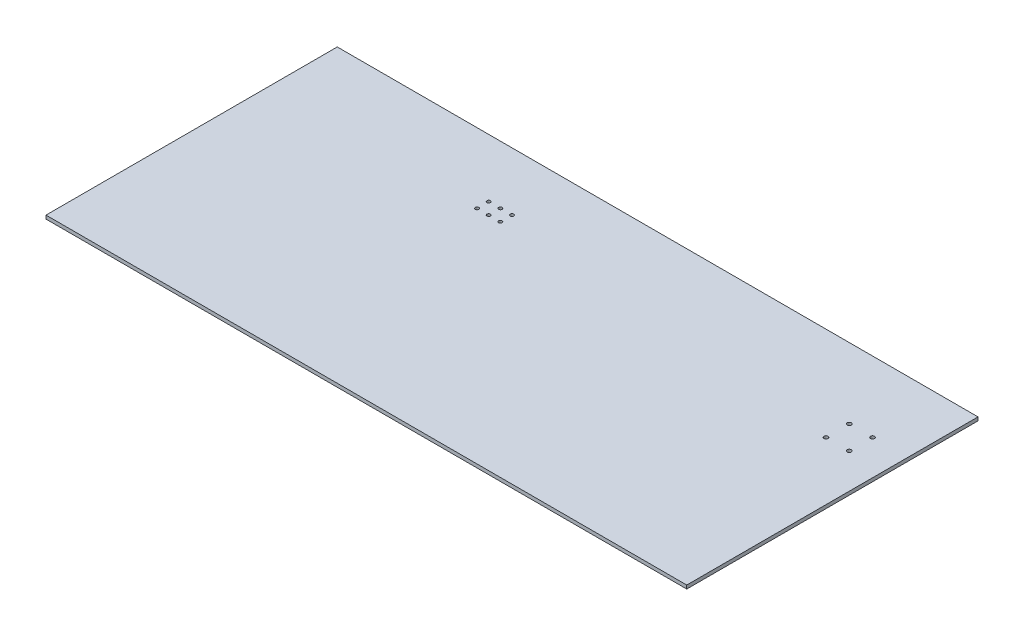
ISO-10303-21;
HEADER;
FILE_DESCRIPTION(('STEP AP214'),'2;1');
FILE_NAME('part.step','',(''),(''),'','','');
FILE_SCHEMA(('AUTOMOTIVE_DESIGN { 1 0 10303 214 1 1 1 1 }'));
ENDSEC;
DATA;
#1=APPLICATION_CONTEXT('core data for automotive mechanical design processes');
#2=APPLICATION_PROTOCOL_DEFINITION('international standard','automotive_design',2000,#1);
#3=PRODUCT_CONTEXT('',#1,'mechanical');
#4=PRODUCT('Part','Part','',(#3));
#5=PRODUCT_RELATED_PRODUCT_CATEGORY('part','',(#4));
#6=PRODUCT_DEFINITION_FORMATION('','',#4);
#7=PRODUCT_DEFINITION_CONTEXT('part definition',#1,'design');
#8=PRODUCT_DEFINITION('design','',#6,#7);
#9=PRODUCT_DEFINITION_SHAPE('','',#8);
#10=(LENGTH_UNIT() NAMED_UNIT(*) SI_UNIT(.MILLI.,.METRE.));
#11=(NAMED_UNIT(*) PLANE_ANGLE_UNIT() SI_UNIT($,.RADIAN.));
#12=(NAMED_UNIT(*) SI_UNIT($,.STERADIAN.) SOLID_ANGLE_UNIT());
#13=UNCERTAINTY_MEASURE_WITH_UNIT(LENGTH_MEASURE(1.E-05),#10,'distance_accuracy_value','');
#14=(GEOMETRIC_REPRESENTATION_CONTEXT(3) GLOBAL_UNCERTAINTY_ASSIGNED_CONTEXT((#13)) GLOBAL_UNIT_ASSIGNED_CONTEXT((#10,
#11,#12)) REPRESENTATION_CONTEXT('',''));
#15=CARTESIAN_POINT('',(0.,0.,0.));
#16=DIRECTION('',(0.,0.,1.));
#17=DIRECTION('',(1.,0.,0.));
#18=AXIS2_PLACEMENT_3D('',#15,#16,#17);
#19=CARTESIAN_POINT('',(-275.,3.,125.));
#20=DIRECTION('',(1.,0.,0.));
#21=DIRECTION('',(0.,0.,-1.));
#22=AXIS2_PLACEMENT_3D('',#19,#20,#21);
#23=PLANE('',#22);
#24=DIRECTION('',(0.,0.,1.));
#25=VECTOR('',#24,1.);
#26=CARTESIAN_POINT('',(-275.,0.,125.));
#27=LINE('',#26,#25);
#28=CARTESIAN_POINT('',(-275.,0.,-125.));
#29=VERTEX_POINT('',#28);
#30=CARTESIAN_POINT('',(-275.,0.,125.));
#31=VERTEX_POINT('',#30);
#32=EDGE_CURVE('E105',#29,#31,#27,.T.);
#33=ORIENTED_EDGE('',*,*,#32,.T.);
#34=DIRECTION('',(0.,-1.,0.));
#35=VECTOR('',#34,1.);
#36=CARTESIAN_POINT('',(-275.,3.,125.));
#37=LINE('',#36,#35);
#38=CARTESIAN_POINT('',(-275.,3.,125.));
#39=VERTEX_POINT('',#38);
#40=EDGE_CURVE('E11',#39,#31,#37,.T.);
#41=ORIENTED_EDGE('',*,*,#40,.F.);
#42=DIRECTION('',(0.,0.,1.));
#43=VECTOR('',#42,1.);
#44=CARTESIAN_POINT('',(-275.,3.,125.));
#45=LINE('',#44,#43);
#46=CARTESIAN_POINT('',(-275.,3.,-125.));
#47=VERTEX_POINT('',#46);
#48=EDGE_CURVE('E92',#47,#39,#45,.T.);
#49=ORIENTED_EDGE('',*,*,#48,.F.);
#50=DIRECTION('',(0.,-1.,0.));
#51=VECTOR('',#50,1.);
#52=CARTESIAN_POINT('',(-275.,3.,-125.));
#53=LINE('',#52,#51);
#54=EDGE_CURVE('E101',#47,#29,#53,.T.);
#55=ORIENTED_EDGE('',*,*,#54,.T.);
#56=EDGE_LOOP('',(#33,#41,#49,#55));
#57=FACE_BOUND('',#56,.T.);
#58=ADVANCED_FACE('F39',(#57),#23,.F.);
#59=CARTESIAN_POINT('',(275.,3.,125.));
#60=DIRECTION('',(0.,0.,-1.));
#61=DIRECTION('',(-1.,0.,0.));
#62=AXIS2_PLACEMENT_3D('',#59,#60,#61);
#63=PLANE('',#62);
#64=DIRECTION('',(1.,0.,0.));
#65=VECTOR('',#64,1.);
#66=CARTESIAN_POINT('',(275.,0.,125.));
#67=LINE('',#66,#65);
#68=CARTESIAN_POINT('',(275.,0.,125.));
#69=VERTEX_POINT('',#68);
#70=EDGE_CURVE('E96',#31,#69,#67,.T.);
#71=ORIENTED_EDGE('',*,*,#70,.T.);
#72=DIRECTION('',(0.,-1.,0.));
#73=VECTOR('',#72,1.);
#74=CARTESIAN_POINT('',(275.,3.,125.));
#75=LINE('',#74,#73);
#76=CARTESIAN_POINT('',(275.,3.,125.));
#77=VERTEX_POINT('',#76);
#78=EDGE_CURVE('E48',#77,#69,#75,.T.);
#79=ORIENTED_EDGE('',*,*,#78,.F.);
#80=DIRECTION('',(1.,0.,0.));
#81=VECTOR('',#80,1.);
#82=CARTESIAN_POINT('',(275.,3.,125.));
#83=LINE('',#82,#81);
#84=EDGE_CURVE('E87',#39,#77,#83,.T.);
#85=ORIENTED_EDGE('',*,*,#84,.F.);
#86=ORIENTED_EDGE('',*,*,#40,.T.);
#87=EDGE_LOOP('',(#71,#79,#85,#86));
#88=FACE_BOUND('',#87,.T.);
#89=ADVANCED_FACE('F95',(#88),#63,.F.);
#90=CARTESIAN_POINT('',(275.,3.,125.));
#91=DIRECTION('',(-1.,0.,0.));
#92=DIRECTION('',(0.,0.,1.));
#93=AXIS2_PLACEMENT_3D('',#90,#91,#92);
#94=PLANE('',#93);
#95=DIRECTION('',(0.,0.,-1.));
#96=VECTOR('',#95,1.);
#97=CARTESIAN_POINT('',(275.,0.,125.));
#98=LINE('',#97,#96);
#99=CARTESIAN_POINT('',(275.,0.,-125.));
#100=VERTEX_POINT('',#99);
#101=EDGE_CURVE('E74',#69,#100,#98,.T.);
#102=ORIENTED_EDGE('',*,*,#101,.T.);
#103=DIRECTION('',(0.,-1.,0.));
#104=VECTOR('',#103,1.);
#105=CARTESIAN_POINT('',(275.,3.,-125.));
#106=LINE('',#105,#104);
#107=CARTESIAN_POINT('',(275.,3.,-125.));
#108=VERTEX_POINT('',#107);
#109=EDGE_CURVE('E97',#108,#100,#106,.T.);
#110=ORIENTED_EDGE('',*,*,#109,.F.);
#111=DIRECTION('',(0.,0.,-1.));
#112=VECTOR('',#111,1.);
#113=CARTESIAN_POINT('',(275.,3.,125.));
#114=LINE('',#113,#112);
#115=EDGE_CURVE('E90',#77,#108,#114,.T.);
#116=ORIENTED_EDGE('',*,*,#115,.F.);
#117=ORIENTED_EDGE('',*,*,#78,.T.);
#118=EDGE_LOOP('',(#102,#110,#116,#117));
#119=FACE_BOUND('',#118,.T.);
#120=ADVANCED_FACE('F99',(#119),#94,.F.);
#121=CARTESIAN_POINT('',(275.,3.,-125.));
#122=DIRECTION('',(0.,0.,1.));
#123=DIRECTION('',(1.,0.,0.));
#124=AXIS2_PLACEMENT_3D('',#121,#122,#123);
#125=PLANE('',#124);
#126=DIRECTION('',(-1.,0.,0.));
#127=VECTOR('',#126,1.);
#128=CARTESIAN_POINT('',(275.,0.,-125.));
#129=LINE('',#128,#127);
#130=EDGE_CURVE('E80',#100,#29,#129,.T.);
#131=ORIENTED_EDGE('',*,*,#130,.T.);
#132=ORIENTED_EDGE('',*,*,#54,.F.);
#133=DIRECTION('',(-1.,0.,0.));
#134=VECTOR('',#133,1.);
#135=CARTESIAN_POINT('',(275.,3.,-125.));
#136=LINE('',#135,#134);
#137=EDGE_CURVE('E57',#108,#47,#136,.T.);
#138=ORIENTED_EDGE('',*,*,#137,.F.);
#139=ORIENTED_EDGE('',*,*,#109,.T.);
#140=EDGE_LOOP('',(#131,#132,#138,#139));
#141=FACE_BOUND('',#140,.T.);
#142=ADVANCED_FACE('F167',(#141),#125,.F.);
#143=CARTESIAN_POINT('',(0.,3.,0.));
#144=DIRECTION('',(0.,1.,0.));
#145=DIRECTION('',(0.,0.,1.));
#146=AXIS2_PLACEMENT_3D('',#143,#144,#145);
#147=PLANE('',#146);
#148=CARTESIAN_POINT('',(-95.,3.,-75.));
#149=DIRECTION('',(0.,1.,0.));
#150=DIRECTION('',(0.,0.,1.));
#151=AXIS2_PLACEMENT_3D('',#148,#149,#150);
#152=CIRCLE('',#151,1.5);
#153=CARTESIAN_POINT('',(-95.,3.,-73.5));
#154=VERTEX_POINT('',#153);
#155=EDGE_CURVE('E350',#154,#154,#152,.T.);
#156=ORIENTED_EDGE('',*,*,#155,.F.);
#157=EDGE_LOOP('',(#156));
#158=FACE_BOUND('',#157,.T.);
#159=CARTESIAN_POINT('',(-75.,3.,-75.));
#160=DIRECTION('',(0.,1.,0.));
#161=DIRECTION('',(0.,0.,1.));
#162=AXIS2_PLACEMENT_3D('',#159,#160,#161);
#163=CIRCLE('',#162,1.5);
#164=CARTESIAN_POINT('',(-75.,3.,-73.5));
#165=VERTEX_POINT('',#164);
#166=EDGE_CURVE('E351',#165,#165,#163,.T.);
#167=ORIENTED_EDGE('',*,*,#166,.F.);
#168=EDGE_LOOP('',(#167));
#169=FACE_BOUND('',#168,.T.);
#170=CARTESIAN_POINT('',(-85.,3.,-75.));
#171=DIRECTION('',(0.,1.,0.));
#172=DIRECTION('',(0.,0.,1.));
#173=AXIS2_PLACEMENT_3D('',#170,#171,#172);
#174=CIRCLE('',#173,1.5);
#175=CARTESIAN_POINT('',(-85.,3.,-73.5));
#176=VERTEX_POINT('',#175);
#177=EDGE_CURVE('E353',#176,#176,#174,.T.);
#178=ORIENTED_EDGE('',*,*,#177,.F.);
#179=EDGE_LOOP('',(#178));
#180=FACE_BOUND('',#179,.T.);
#181=CARTESIAN_POINT('',(-75.,3.,-65.));
#182=DIRECTION('',(0.,1.,0.));
#183=DIRECTION('',(0.,0.,1.));
#184=AXIS2_PLACEMENT_3D('',#181,#182,#183);
#185=CIRCLE('',#184,1.5);
#186=CARTESIAN_POINT('',(-75.,3.,-63.5));
#187=VERTEX_POINT('',#186);
#188=EDGE_CURVE('E358',#187,#187,#185,.T.);
#189=ORIENTED_EDGE('',*,*,#188,.F.);
#190=EDGE_LOOP('',(#189));
#191=FACE_BOUND('',#190,.T.);
#192=CARTESIAN_POINT('',(-85.,3.,-65.));
#193=DIRECTION('',(0.,1.,0.));
#194=DIRECTION('',(0.,0.,1.));
#195=AXIS2_PLACEMENT_3D('',#192,#193,#194);
#196=CIRCLE('',#195,1.5);
#197=CARTESIAN_POINT('',(-85.,3.,-63.5));
#198=VERTEX_POINT('',#197);
#199=EDGE_CURVE('E361',#198,#198,#196,.T.);
#200=ORIENTED_EDGE('',*,*,#199,.F.);
#201=EDGE_LOOP('',(#200));
#202=FACE_BOUND('',#201,.T.);
#203=CARTESIAN_POINT('',(-95.,3.,-65.));
#204=DIRECTION('',(0.,1.,0.));
#205=DIRECTION('',(0.,0.,1.));
#206=AXIS2_PLACEMENT_3D('',#203,#204,#205);
#207=CIRCLE('',#206,1.5);
#208=CARTESIAN_POINT('',(-95.,3.,-63.5));
#209=VERTEX_POINT('',#208);
#210=EDGE_CURVE('E130',#209,#209,#207,.T.);
#211=ORIENTED_EDGE('',*,*,#210,.F.);
#212=EDGE_LOOP('',(#211));
#213=FACE_BOUND('',#212,.T.);
#214=CARTESIAN_POINT('',(245.,3.,-64.5));
#215=DIRECTION('',(0.,1.,0.));
#216=DIRECTION('',(0.,0.,1.));
#217=AXIS2_PLACEMENT_3D('',#214,#215,#216);
#218=CIRCLE('',#217,1.75000000000001);
#219=CARTESIAN_POINT('',(245.,3.,-62.75));
#220=VERTEX_POINT('',#219);
#221=EDGE_CURVE('E152',#220,#220,#218,.T.);
#222=ORIENTED_EDGE('',*,*,#221,.F.);
#223=EDGE_LOOP('',(#222));
#224=FACE_BOUND('',#223,.T.);
#225=CARTESIAN_POINT('',(225.,3.,-44.5));
#226=DIRECTION('',(0.,1.,0.));
#227=DIRECTION('',(0.,0.,1.));
#228=AXIS2_PLACEMENT_3D('',#225,#226,#227);
#229=CIRCLE('',#228,1.75000000000001);
#230=CARTESIAN_POINT('',(225.,3.,-42.75));
#231=VERTEX_POINT('',#230);
#232=EDGE_CURVE('E147',#231,#231,#229,.T.);
#233=ORIENTED_EDGE('',*,*,#232,.F.);
#234=EDGE_LOOP('',(#233));
#235=FACE_BOUND('',#234,.T.);
#236=CARTESIAN_POINT('',(245.,3.,-44.5));
#237=DIRECTION('',(0.,1.,0.));
#238=DIRECTION('',(0.,0.,1.));
#239=AXIS2_PLACEMENT_3D('',#236,#237,#238);
#240=CIRCLE('',#239,1.75000000000001);
#241=CARTESIAN_POINT('',(245.,3.,-42.75));
#242=VERTEX_POINT('',#241);
#243=EDGE_CURVE('E143',#242,#242,#240,.T.);
#244=ORIENTED_EDGE('',*,*,#243,.F.);
#245=EDGE_LOOP('',(#244));
#246=FACE_BOUND('',#245,.T.);
#247=CARTESIAN_POINT('',(225.,3.,-64.5));
#248=DIRECTION('',(0.,1.,0.));
#249=DIRECTION('',(0.,0.,1.));
#250=AXIS2_PLACEMENT_3D('',#247,#248,#249);
#251=CIRCLE('',#250,1.75000000000001);
#252=CARTESIAN_POINT('',(225.,3.,-62.75));
#253=VERTEX_POINT('',#252);
#254=EDGE_CURVE('E118',#253,#253,#251,.T.);
#255=ORIENTED_EDGE('',*,*,#254,.F.);
#256=EDGE_LOOP('',(#255));
#257=FACE_BOUND('',#256,.T.);
#258=ORIENTED_EDGE('',*,*,#48,.T.);
#259=ORIENTED_EDGE('',*,*,#84,.T.);
#260=ORIENTED_EDGE('',*,*,#115,.T.);
#261=ORIENTED_EDGE('',*,*,#137,.T.);
#262=EDGE_LOOP('',(#258,#259,#260,#261));
#263=FACE_BOUND('',#262,.T.);
#264=ADVANCED_FACE('F88',(#158,#169,#180,#191,#202,#213,#224,#235,#246,#257,#263),#147,.T.);
#265=CARTESIAN_POINT('',(0.,0.,0.));
#266=DIRECTION('',(0.,1.,0.));
#267=DIRECTION('',(0.,0.,1.));
#268=AXIS2_PLACEMENT_3D('',#265,#266,#267);
#269=PLANE('',#268);
#270=CARTESIAN_POINT('',(-95.,0.,-75.));
#271=DIRECTION('',(0.,1.,0.));
#272=DIRECTION('',(0.,0.,1.));
#273=AXIS2_PLACEMENT_3D('',#270,#271,#272);
#274=CIRCLE('',#273,1.5);
#275=CARTESIAN_POINT('',(-95.,0.,-73.5));
#276=VERTEX_POINT('',#275);
#277=EDGE_CURVE('E42',#276,#276,#274,.T.);
#278=ORIENTED_EDGE('',*,*,#277,.T.);
#279=EDGE_LOOP('',(#278));
#280=FACE_BOUND('',#279,.T.);
#281=CARTESIAN_POINT('',(-75.,0.,-75.));
#282=DIRECTION('',(0.,1.,0.));
#283=DIRECTION('',(0.,0.,1.));
#284=AXIS2_PLACEMENT_3D('',#281,#282,#283);
#285=CIRCLE('',#284,1.5);
#286=CARTESIAN_POINT('',(-75.,0.,-73.5));
#287=VERTEX_POINT('',#286);
#288=EDGE_CURVE('E138',#287,#287,#285,.T.);
#289=ORIENTED_EDGE('',*,*,#288,.T.);
#290=EDGE_LOOP('',(#289));
#291=FACE_BOUND('',#290,.T.);
#292=CARTESIAN_POINT('',(-85.,0.,-75.));
#293=DIRECTION('',(0.,1.,0.));
#294=DIRECTION('',(0.,0.,1.));
#295=AXIS2_PLACEMENT_3D('',#292,#293,#294);
#296=CIRCLE('',#295,1.5);
#297=CARTESIAN_POINT('',(-85.,0.,-73.5));
#298=VERTEX_POINT('',#297);
#299=EDGE_CURVE('E136',#298,#298,#296,.T.);
#300=ORIENTED_EDGE('',*,*,#299,.T.);
#301=EDGE_LOOP('',(#300));
#302=FACE_BOUND('',#301,.T.);
#303=CARTESIAN_POINT('',(-75.,0.,-65.));
#304=DIRECTION('',(0.,1.,0.));
#305=DIRECTION('',(0.,0.,1.));
#306=AXIS2_PLACEMENT_3D('',#303,#304,#305);
#307=CIRCLE('',#306,1.5);
#308=CARTESIAN_POINT('',(-75.,0.,-63.5));
#309=VERTEX_POINT('',#308);
#310=EDGE_CURVE('E133',#309,#309,#307,.T.);
#311=ORIENTED_EDGE('',*,*,#310,.T.);
#312=EDGE_LOOP('',(#311));
#313=FACE_BOUND('',#312,.T.);
#314=CARTESIAN_POINT('',(-85.,0.,-65.));
#315=DIRECTION('',(0.,1.,0.));
#316=DIRECTION('',(0.,0.,1.));
#317=AXIS2_PLACEMENT_3D('',#314,#315,#316);
#318=CIRCLE('',#317,1.5);
#319=CARTESIAN_POINT('',(-85.,0.,-63.5));
#320=VERTEX_POINT('',#319);
#321=EDGE_CURVE('E129',#320,#320,#318,.T.);
#322=ORIENTED_EDGE('',*,*,#321,.T.);
#323=EDGE_LOOP('',(#322));
#324=FACE_BOUND('',#323,.T.);
#325=CARTESIAN_POINT('',(-95.,0.,-65.));
#326=DIRECTION('',(0.,1.,0.));
#327=DIRECTION('',(0.,0.,1.));
#328=AXIS2_PLACEMENT_3D('',#325,#326,#327);
#329=CIRCLE('',#328,1.5);
#330=CARTESIAN_POINT('',(-95.,0.,-63.5));
#331=VERTEX_POINT('',#330);
#332=EDGE_CURVE('E126',#331,#331,#329,.T.);
#333=ORIENTED_EDGE('',*,*,#332,.T.);
#334=EDGE_LOOP('',(#333));
#335=FACE_BOUND('',#334,.T.);
#336=CARTESIAN_POINT('',(245.,0.,-64.5));
#337=DIRECTION('',(0.,1.,0.));
#338=DIRECTION('',(0.,0.,1.));
#339=AXIS2_PLACEMENT_3D('',#336,#337,#338);
#340=CIRCLE('',#339,1.75000000000001);
#341=CARTESIAN_POINT('',(245.,0.,-62.75));
#342=VERTEX_POINT('',#341);
#343=EDGE_CURVE('E108',#342,#342,#340,.T.);
#344=ORIENTED_EDGE('',*,*,#343,.T.);
#345=EDGE_LOOP('',(#344));
#346=FACE_BOUND('',#345,.T.);
#347=CARTESIAN_POINT('',(225.,0.,-44.5));
#348=DIRECTION('',(0.,1.,0.));
#349=DIRECTION('',(0.,0.,1.));
#350=AXIS2_PLACEMENT_3D('',#347,#348,#349);
#351=CIRCLE('',#350,1.75000000000001);
#352=CARTESIAN_POINT('',(225.,0.,-42.75));
#353=VERTEX_POINT('',#352);
#354=EDGE_CURVE('E121',#353,#353,#351,.T.);
#355=ORIENTED_EDGE('',*,*,#354,.T.);
#356=EDGE_LOOP('',(#355));
#357=FACE_BOUND('',#356,.T.);
#358=CARTESIAN_POINT('',(245.,0.,-44.5));
#359=DIRECTION('',(0.,1.,0.));
#360=DIRECTION('',(0.,0.,1.));
#361=AXIS2_PLACEMENT_3D('',#358,#359,#360);
#362=CIRCLE('',#361,1.75000000000001);
#363=CARTESIAN_POINT('',(245.,0.,-42.75));
#364=VERTEX_POINT('',#363);
#365=EDGE_CURVE('E117',#364,#364,#362,.T.);
#366=ORIENTED_EDGE('',*,*,#365,.T.);
#367=EDGE_LOOP('',(#366));
#368=FACE_BOUND('',#367,.T.);
#369=CARTESIAN_POINT('',(225.,0.,-64.5));
#370=DIRECTION('',(0.,1.,0.));
#371=DIRECTION('',(0.,0.,1.));
#372=AXIS2_PLACEMENT_3D('',#369,#370,#371);
#373=CIRCLE('',#372,1.75000000000001);
#374=CARTESIAN_POINT('',(225.,0.,-62.75));
#375=VERTEX_POINT('',#374);
#376=EDGE_CURVE('E114',#375,#375,#373,.T.);
#377=ORIENTED_EDGE('',*,*,#376,.T.);
#378=EDGE_LOOP('',(#377));
#379=FACE_BOUND('',#378,.T.);
#380=ORIENTED_EDGE('',*,*,#32,.F.);
#381=ORIENTED_EDGE('',*,*,#130,.F.);
#382=ORIENTED_EDGE('',*,*,#101,.F.);
#383=ORIENTED_EDGE('',*,*,#70,.F.);
#384=EDGE_LOOP('',(#380,#381,#382,#383));
#385=FACE_BOUND('',#384,.T.);
#386=ADVANCED_FACE('F166',(#280,#291,#302,#313,#324,#335,#346,#357,#368,#379,#385),#269,.F.);
#387=CARTESIAN_POINT('',(225.,-7.,-64.5));
#388=DIRECTION('',(0.,1.,0.));
#389=DIRECTION('',(0.,0.,1.));
#390=AXIS2_PLACEMENT_3D('',#387,#388,#389);
#391=CYLINDRICAL_SURFACE('',#390,1.75000000000001);
#392=ORIENTED_EDGE('',*,*,#254,.T.);
#393=EDGE_LOOP('',(#392));
#394=FACE_BOUND('',#393,.T.);
#395=ORIENTED_EDGE('',*,*,#376,.F.);
#396=EDGE_LOOP('',(#395));
#397=FACE_BOUND('',#396,.T.);
#398=ADVANCED_FACE('F162',(#394,#397),#391,.F.);
#399=CARTESIAN_POINT('',(245.,-7.,-44.5));
#400=DIRECTION('',(0.,1.,0.));
#401=DIRECTION('',(0.,0.,1.));
#402=AXIS2_PLACEMENT_3D('',#399,#400,#401);
#403=CYLINDRICAL_SURFACE('',#402,1.75000000000001);
#404=ORIENTED_EDGE('',*,*,#243,.T.);
#405=EDGE_LOOP('',(#404));
#406=FACE_BOUND('',#405,.T.);
#407=ORIENTED_EDGE('',*,*,#365,.F.);
#408=EDGE_LOOP('',(#407));
#409=FACE_BOUND('',#408,.T.);
#410=ADVANCED_FACE('F207',(#406,#409),#403,.F.);
#411=CARTESIAN_POINT('',(225.,-7.,-44.5));
#412=DIRECTION('',(0.,1.,0.));
#413=DIRECTION('',(0.,0.,1.));
#414=AXIS2_PLACEMENT_3D('',#411,#412,#413);
#415=CYLINDRICAL_SURFACE('',#414,1.75000000000001);
#416=ORIENTED_EDGE('',*,*,#232,.T.);
#417=EDGE_LOOP('',(#416));
#418=FACE_BOUND('',#417,.T.);
#419=ORIENTED_EDGE('',*,*,#354,.F.);
#420=EDGE_LOOP('',(#419));
#421=FACE_BOUND('',#420,.T.);
#422=ADVANCED_FACE('F217',(#418,#421),#415,.F.);
#423=CARTESIAN_POINT('',(245.,-7.,-64.5));
#424=DIRECTION('',(0.,1.,0.));
#425=DIRECTION('',(0.,0.,1.));
#426=AXIS2_PLACEMENT_3D('',#423,#424,#425);
#427=CYLINDRICAL_SURFACE('',#426,1.75000000000001);
#428=ORIENTED_EDGE('',*,*,#221,.T.);
#429=EDGE_LOOP('',(#428));
#430=FACE_BOUND('',#429,.T.);
#431=ORIENTED_EDGE('',*,*,#343,.F.);
#432=EDGE_LOOP('',(#431));
#433=FACE_BOUND('',#432,.T.);
#434=ADVANCED_FACE('F227',(#430,#433),#427,.F.);
#435=CARTESIAN_POINT('',(-95.,-17.,-65.));
#436=DIRECTION('',(0.,1.,0.));
#437=DIRECTION('',(0.,0.,1.));
#438=AXIS2_PLACEMENT_3D('',#435,#436,#437);
#439=CYLINDRICAL_SURFACE('',#438,1.5);
#440=ORIENTED_EDGE('',*,*,#210,.T.);
#441=EDGE_LOOP('',(#440));
#442=FACE_BOUND('',#441,.T.);
#443=ORIENTED_EDGE('',*,*,#332,.F.);
#444=EDGE_LOOP('',(#443));
#445=FACE_BOUND('',#444,.T.);
#446=ADVANCED_FACE('F237',(#442,#445),#439,.F.);
#447=CARTESIAN_POINT('',(-85.,-17.,-65.));
#448=DIRECTION('',(0.,1.,0.));
#449=DIRECTION('',(0.,0.,1.));
#450=AXIS2_PLACEMENT_3D('',#447,#448,#449);
#451=CYLINDRICAL_SURFACE('',#450,1.5);
#452=ORIENTED_EDGE('',*,*,#199,.T.);
#453=EDGE_LOOP('',(#452));
#454=FACE_BOUND('',#453,.T.);
#455=ORIENTED_EDGE('',*,*,#321,.F.);
#456=EDGE_LOOP('',(#455));
#457=FACE_BOUND('',#456,.T.);
#458=ADVANCED_FACE('F259',(#454,#457),#451,.F.);
#459=CARTESIAN_POINT('',(-75.,-17.,-65.));
#460=DIRECTION('',(0.,1.,0.));
#461=DIRECTION('',(0.,0.,1.));
#462=AXIS2_PLACEMENT_3D('',#459,#460,#461);
#463=CYLINDRICAL_SURFACE('',#462,1.5);
#464=ORIENTED_EDGE('',*,*,#188,.T.);
#465=EDGE_LOOP('',(#464));
#466=FACE_BOUND('',#465,.T.);
#467=ORIENTED_EDGE('',*,*,#310,.F.);
#468=EDGE_LOOP('',(#467));
#469=FACE_BOUND('',#468,.T.);
#470=ADVANCED_FACE('F270',(#466,#469),#463,.F.);
#471=CARTESIAN_POINT('',(-85.,-17.,-75.));
#472=DIRECTION('',(0.,1.,0.));
#473=DIRECTION('',(0.,0.,1.));
#474=AXIS2_PLACEMENT_3D('',#471,#472,#473);
#475=CYLINDRICAL_SURFACE('',#474,1.5);
#476=ORIENTED_EDGE('',*,*,#177,.T.);
#477=EDGE_LOOP('',(#476));
#478=FACE_BOUND('',#477,.T.);
#479=ORIENTED_EDGE('',*,*,#299,.F.);
#480=EDGE_LOOP('',(#479));
#481=FACE_BOUND('',#480,.T.);
#482=ADVANCED_FACE('F281',(#478,#481),#475,.F.);
#483=CARTESIAN_POINT('',(-75.,-17.,-75.));
#484=DIRECTION('',(0.,1.,0.));
#485=DIRECTION('',(0.,0.,1.));
#486=AXIS2_PLACEMENT_3D('',#483,#484,#485);
#487=CYLINDRICAL_SURFACE('',#486,1.5);
#488=ORIENTED_EDGE('',*,*,#166,.T.);
#489=EDGE_LOOP('',(#488));
#490=FACE_BOUND('',#489,.T.);
#491=ORIENTED_EDGE('',*,*,#288,.F.);
#492=EDGE_LOOP('',(#491));
#493=FACE_BOUND('',#492,.T.);
#494=ADVANCED_FACE('F292',(#490,#493),#487,.F.);
#495=CARTESIAN_POINT('',(-95.,-17.,-75.));
#496=DIRECTION('',(0.,1.,0.));
#497=DIRECTION('',(0.,0.,1.));
#498=AXIS2_PLACEMENT_3D('',#495,#496,#497);
#499=CYLINDRICAL_SURFACE('',#498,1.5);
#500=ORIENTED_EDGE('',*,*,#155,.T.);
#501=EDGE_LOOP('',(#500));
#502=FACE_BOUND('',#501,.T.);
#503=ORIENTED_EDGE('',*,*,#277,.F.);
#504=EDGE_LOOP('',(#503));
#505=FACE_BOUND('',#504,.T.);
#506=ADVANCED_FACE('F303',(#502,#505),#499,.F.);
#507=CLOSED_SHELL('',(#58,#89,#120,#142,#264,#386,#398,#410,#422,#434,#446,#458,#470,#482,#494,#506));
#508=MANIFOLD_SOLID_BREP('B2',#507);
#509=ADVANCED_BREP_SHAPE_REPRESENTATION('',(#18,#508),#14);
#510=SHAPE_DEFINITION_REPRESENTATION(#9,#509);
ENDSEC;
END-ISO-10303-21;
